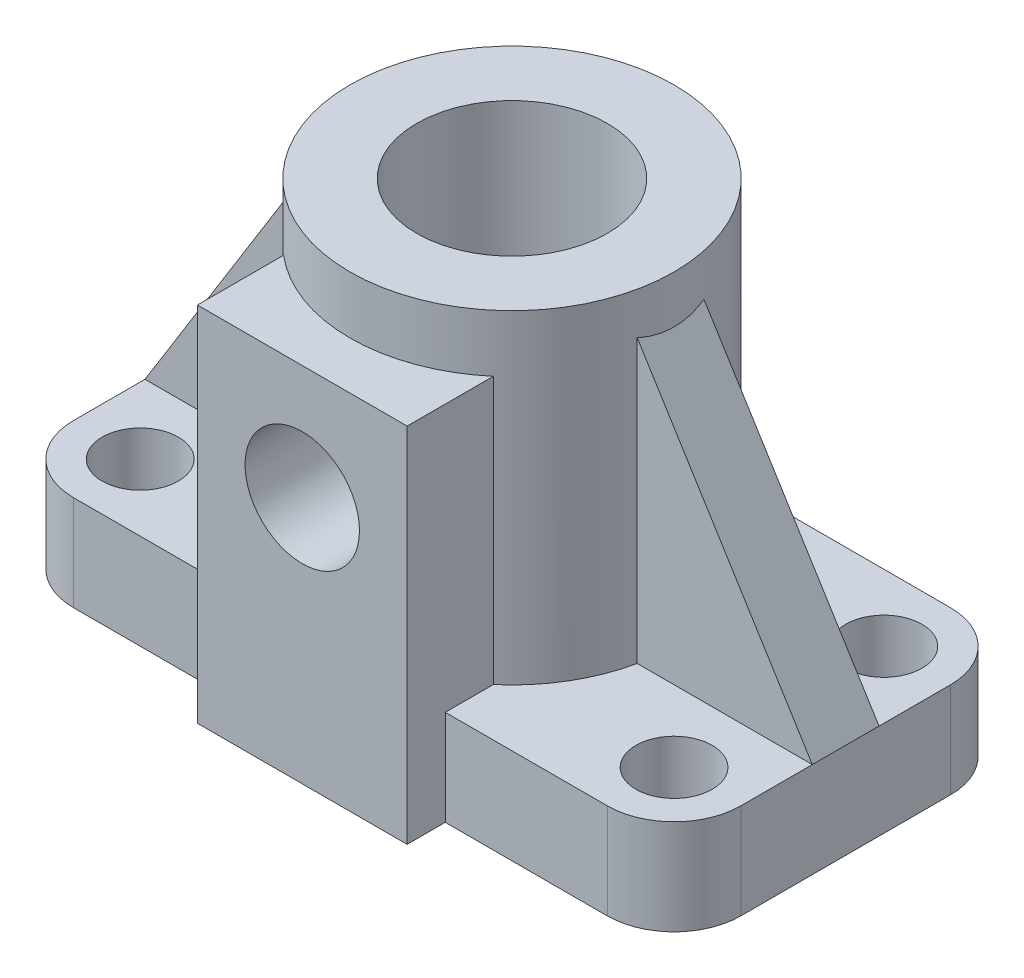
ISO-10303-21;
HEADER;
FILE_DESCRIPTION(('STEP AP214'),'2;1');
FILE_NAME('part.step','',(''),(''),'','','');
FILE_SCHEMA(('AUTOMOTIVE_DESIGN { 1 0 10303 214 1 1 1 1 }'));
ENDSEC;
DATA;
#1=APPLICATION_CONTEXT('core data for automotive mechanical design processes');
#2=APPLICATION_PROTOCOL_DEFINITION('international standard','automotive_design',2000,#1);
#3=PRODUCT_CONTEXT('',#1,'mechanical');
#4=PRODUCT('Part','Part','',(#3));
#5=PRODUCT_RELATED_PRODUCT_CATEGORY('part','',(#4));
#6=PRODUCT_DEFINITION_FORMATION('','',#4);
#7=PRODUCT_DEFINITION_CONTEXT('part definition',#1,'design');
#8=PRODUCT_DEFINITION('design','',#6,#7);
#9=PRODUCT_DEFINITION_SHAPE('','',#8);
#10=(LENGTH_UNIT() NAMED_UNIT(*) SI_UNIT(.MILLI.,.METRE.));
#11=(NAMED_UNIT(*) PLANE_ANGLE_UNIT() SI_UNIT($,.RADIAN.));
#12=(NAMED_UNIT(*) SI_UNIT($,.STERADIAN.) SOLID_ANGLE_UNIT());
#13=UNCERTAINTY_MEASURE_WITH_UNIT(LENGTH_MEASURE(1.E-05),#10,'distance_accuracy_value','');
#14=(GEOMETRIC_REPRESENTATION_CONTEXT(3) GLOBAL_UNCERTAINTY_ASSIGNED_CONTEXT((#13)) GLOBAL_UNIT_ASSIGNED_CONTEXT((#10,
#11,#12)) REPRESENTATION_CONTEXT('',''));
#15=CARTESIAN_POINT('',(0.,0.,0.));
#16=DIRECTION('',(0.,0.,1.));
#17=DIRECTION('',(1.,0.,0.));
#18=AXIS2_PLACEMENT_3D('',#15,#16,#17);
#19=CARTESIAN_POINT('',(-28.,10.,11.));
#20=DIRECTION('',(0.,-1.,0.));
#21=DIRECTION('',(0.,0.,-1.));
#22=AXIS2_PLACEMENT_3D('',#19,#20,#21);
#23=PLANE('',#22);
#24=CARTESIAN_POINT('',(28.,10.,-11.));
#25=DIRECTION('',(0.,1.,0.));
#26=DIRECTION('',(0.,0.,1.));
#27=AXIS2_PLACEMENT_3D('',#24,#25,#26);
#28=CIRCLE('',#27,4.);
#29=CARTESIAN_POINT('',(28.,10.,-7.));
#30=VERTEX_POINT('',#29);
#31=EDGE_CURVE('E248',#30,#30,#28,.T.);
#32=ORIENTED_EDGE('',*,*,#31,.F.);
#33=EDGE_LOOP('',(#32));
#34=FACE_BOUND('',#33,.T.);
#35=CARTESIAN_POINT('',(-28.,10.,-11.));
#36=DIRECTION('',(0.,1.,0.));
#37=DIRECTION('',(0.,0.,1.));
#38=AXIS2_PLACEMENT_3D('',#35,#36,#37);
#39=CIRCLE('',#38,4.);
#40=CARTESIAN_POINT('',(-28.,10.,-7.));
#41=VERTEX_POINT('',#40);
#42=EDGE_CURVE('E265',#41,#41,#39,.T.);
#43=ORIENTED_EDGE('',*,*,#42,.F.);
#44=EDGE_LOOP('',(#43));
#45=FACE_BOUND('',#44,.T.);
#46=DIRECTION('',(-1.,0.,0.));
#47=VECTOR('',#46,1.);
#48=CARTESIAN_POINT('',(-28.,10.,-3.5));
#49=LINE('',#48,#47);
#50=CARTESIAN_POINT('',(35.,10.,-3.5));
#51=VERTEX_POINT('',#50);
#52=CARTESIAN_POINT('',(16.6358047596141,10.,-3.5));
#53=VERTEX_POINT('',#52);
#54=EDGE_CURVE('E69',#51,#53,#49,.T.);
#55=ORIENTED_EDGE('',*,*,#54,.F.);
#56=DIRECTION('',(0.,0.,-1.));
#57=VECTOR('',#56,1.);
#58=CARTESIAN_POINT('',(35.,10.,10.9999999999999));
#59=LINE('',#58,#57);
#60=CARTESIAN_POINT('',(35.,10.,-10.9999999999999));
#61=VERTEX_POINT('',#60);
#62=EDGE_CURVE('E212',#51,#61,#59,.T.);
#63=ORIENTED_EDGE('',*,*,#62,.T.);
#64=CARTESIAN_POINT('',(28.,10.,-11.));
#65=DIRECTION('',(0.,1.,0.));
#66=DIRECTION('',(0.,0.,-1.));
#67=AXIS2_PLACEMENT_3D('',#64,#65,#66);
#68=CIRCLE('',#67,7.);
#69=CARTESIAN_POINT('',(28.,10.,-18.));
#70=VERTEX_POINT('',#69);
#71=EDGE_CURVE('E225',#61,#70,#68,.T.);
#72=ORIENTED_EDGE('',*,*,#71,.T.);
#73=DIRECTION('',(-1.,0.,0.));
#74=VECTOR('',#73,1.);
#75=CARTESIAN_POINT('',(-28.,10.,-18.));
#76=LINE('',#75,#74);
#77=CARTESIAN_POINT('',(-28.,10.,-18.));
#78=VERTEX_POINT('',#77);
#79=EDGE_CURVE('E230',#70,#78,#76,.T.);
#80=ORIENTED_EDGE('',*,*,#79,.T.);
#81=CARTESIAN_POINT('',(-28.,10.,-11.));
#82=DIRECTION('',(0.,1.,0.));
#83=DIRECTION('',(0.,0.,-1.));
#84=AXIS2_PLACEMENT_3D('',#81,#82,#83);
#85=CIRCLE('',#84,7.);
#86=CARTESIAN_POINT('',(-35.,10.,-10.9999999999999));
#87=VERTEX_POINT('',#86);
#88=EDGE_CURVE('E397',#78,#87,#85,.T.);
#89=ORIENTED_EDGE('',*,*,#88,.T.);
#90=DIRECTION('',(0.,0.,1.));
#91=VECTOR('',#90,1.);
#92=CARTESIAN_POINT('',(-35.,10.,10.9999999999999));
#93=LINE('',#92,#91);
#94=CARTESIAN_POINT('',(-35.,10.,-3.5));
#95=VERTEX_POINT('',#94);
#96=EDGE_CURVE('E393',#87,#95,#93,.T.);
#97=ORIENTED_EDGE('',*,*,#96,.T.);
#98=DIRECTION('',(-1.,0.,0.));
#99=VECTOR('',#98,1.);
#100=CARTESIAN_POINT('',(-28.,10.,-3.5));
#101=LINE('',#100,#99);
#102=CARTESIAN_POINT('',(-16.6358047596141,10.,-3.5));
#103=VERTEX_POINT('',#102);
#104=EDGE_CURVE('E430',#103,#95,#101,.T.);
#105=ORIENTED_EDGE('',*,*,#104,.F.);
#106=CARTESIAN_POINT('',(0.,10.,0.));
#107=DIRECTION('',(0.,-1.,0.));
#108=DIRECTION('',(0.,0.,-1.));
#109=AXIS2_PLACEMENT_3D('',#106,#107,#108);
#110=CIRCLE('',#109,17.);
#111=EDGE_CURVE('E216',#103,#53,#110,.T.);
#112=ORIENTED_EDGE('',*,*,#111,.T.);
#113=EDGE_LOOP('',(#55,#63,#72,#80,#89,#97,#105,#112));
#114=FACE_BOUND('',#113,.T.);
#115=ADVANCED_FACE('F51',(#34,#45,#114),#23,.F.);
#116=CARTESIAN_POINT('',(28.,10.,11.));
#117=DIRECTION('',(0.,1.,0.));
#118=DIRECTION('',(0.,0.,1.));
#119=AXIS2_PLACEMENT_3D('',#116,#117,#118);
#120=CIRCLE('',#119,4.);
#121=CARTESIAN_POINT('',(28.,10.,15.));
#122=VERTEX_POINT('',#121);
#123=EDGE_CURVE('E247',#122,#122,#120,.T.);
#124=ORIENTED_EDGE('',*,*,#123,.F.);
#125=EDGE_LOOP('',(#124));
#126=FACE_BOUND('',#125,.T.);
#127=CARTESIAN_POINT('',(35.,10.,11.));
#128=VERTEX_POINT('',#127);
#129=CARTESIAN_POINT('',(35.,10.,3.5));
#130=VERTEX_POINT('',#129);
#131=EDGE_CURVE('E224',#128,#130,#59,.T.);
#132=ORIENTED_EDGE('',*,*,#131,.T.);
#133=DIRECTION('',(-1.,0.,0.));
#134=VECTOR('',#133,1.);
#135=CARTESIAN_POINT('',(-28.,10.,3.5));
#136=LINE('',#135,#134);
#137=CARTESIAN_POINT('',(16.6358047596141,10.,3.5));
#138=VERTEX_POINT('',#137);
#139=EDGE_CURVE('E765',#130,#138,#136,.T.);
#140=ORIENTED_EDGE('',*,*,#139,.T.);
#141=CARTESIAN_POINT('',(11.,10.,12.9614813968157));
#142=VERTEX_POINT('',#141);
#143=EDGE_CURVE('E360',#138,#142,#110,.T.);
#144=ORIENTED_EDGE('',*,*,#143,.T.);
#145=DIRECTION('',(0.,0.,-1.));
#146=VECTOR('',#145,1.);
#147=CARTESIAN_POINT('',(11.,10.,11.));
#148=LINE('',#147,#146);
#149=CARTESIAN_POINT('',(11.,10.,18.));
#150=VERTEX_POINT('',#149);
#151=EDGE_CURVE('E321',#150,#142,#148,.T.);
#152=ORIENTED_EDGE('',*,*,#151,.F.);
#153=DIRECTION('',(1.,0.,0.));
#154=VECTOR('',#153,1.);
#155=CARTESIAN_POINT('',(-28.,10.,18.));
#156=LINE('',#155,#154);
#157=CARTESIAN_POINT('',(28.,10.,18.));
#158=VERTEX_POINT('',#157);
#159=EDGE_CURVE('E242',#150,#158,#156,.T.);
#160=ORIENTED_EDGE('',*,*,#159,.T.);
#161=CARTESIAN_POINT('',(28.,10.,11.));
#162=DIRECTION('',(0.,1.,0.));
#163=DIRECTION('',(0.,0.,1.));
#164=AXIS2_PLACEMENT_3D('',#161,#162,#163);
#165=CIRCLE('',#164,7.);
#166=EDGE_CURVE('E229',#158,#128,#165,.T.);
#167=ORIENTED_EDGE('',*,*,#166,.T.);
#168=EDGE_LOOP('',(#132,#140,#144,#152,#160,#167));
#169=FACE_BOUND('',#168,.T.);
#170=ADVANCED_FACE('F357',(#126,#169),#23,.F.);
#171=CARTESIAN_POINT('',(-28.,0.,11.));
#172=DIRECTION('',(0.,-1.,0.));
#173=DIRECTION('',(0.,0.,-1.));
#174=AXIS2_PLACEMENT_3D('',#171,#172,#173);
#175=PLANE('',#174);
#176=CARTESIAN_POINT('',(0.,0.,0.));
#177=DIRECTION('',(0.,-1.,0.));
#178=DIRECTION('',(0.,0.,-1.));
#179=AXIS2_PLACEMENT_3D('',#176,#177,#178);
#180=CIRCLE('',#179,10.);
#181=CARTESIAN_POINT('',(0.,0.,-10.));
#182=VERTEX_POINT('',#181);
#183=EDGE_CURVE('E748',#182,#182,#180,.T.);
#184=ORIENTED_EDGE('',*,*,#183,.F.);
#185=EDGE_LOOP('',(#184));
#186=FACE_BOUND('',#185,.T.);
#187=CARTESIAN_POINT('',(28.,0.,-11.));
#188=DIRECTION('',(0.,1.,0.));
#189=DIRECTION('',(0.,0.,-1.));
#190=AXIS2_PLACEMENT_3D('',#187,#188,#189);
#191=CIRCLE('',#190,7.);
#192=CARTESIAN_POINT('',(35.,0.,-10.9999999999999));
#193=VERTEX_POINT('',#192);
#194=CARTESIAN_POINT('',(28.,0.,-18.));
#195=VERTEX_POINT('',#194);
#196=EDGE_CURVE('E376',#193,#195,#191,.T.);
#197=ORIENTED_EDGE('',*,*,#196,.F.);
#198=DIRECTION('',(0.,0.,-1.));
#199=VECTOR('',#198,1.);
#200=CARTESIAN_POINT('',(35.,0.,10.9999999999999));
#201=LINE('',#200,#199);
#202=CARTESIAN_POINT('',(35.,0.,11.));
#203=VERTEX_POINT('',#202);
#204=EDGE_CURVE('E379',#203,#193,#201,.T.);
#205=ORIENTED_EDGE('',*,*,#204,.F.);
#206=CARTESIAN_POINT('',(28.,0.,11.));
#207=DIRECTION('',(0.,1.,0.));
#208=DIRECTION('',(0.,0.,1.));
#209=AXIS2_PLACEMENT_3D('',#206,#207,#208);
#210=CIRCLE('',#209,7.);
#211=CARTESIAN_POINT('',(28.,0.,18.));
#212=VERTEX_POINT('',#211);
#213=EDGE_CURVE('E281',#212,#203,#210,.T.);
#214=ORIENTED_EDGE('',*,*,#213,.F.);
#215=DIRECTION('',(1.,0.,0.));
#216=VECTOR('',#215,1.);
#217=CARTESIAN_POINT('',(-28.,0.,18.));
#218=LINE('',#217,#216);
#219=CARTESIAN_POINT('',(11.,0.,18.));
#220=VERTEX_POINT('',#219);
#221=EDGE_CURVE('E280',#220,#212,#218,.T.);
#222=ORIENTED_EDGE('',*,*,#221,.F.);
#223=DIRECTION('',(0.,0.,-1.));
#224=VECTOR('',#223,1.);
#225=CARTESIAN_POINT('',(11.,0.,11.));
#226=LINE('',#225,#224);
#227=CARTESIAN_POINT('',(11.,0.,22.));
#228=VERTEX_POINT('',#227);
#229=EDGE_CURVE('E61',#228,#220,#226,.T.);
#230=ORIENTED_EDGE('',*,*,#229,.F.);
#231=DIRECTION('',(-1.,0.,0.));
#232=VECTOR('',#231,1.);
#233=CARTESIAN_POINT('',(-28.,0.,22.));
#234=LINE('',#233,#232);
#235=CARTESIAN_POINT('',(-11.,0.,22.));
#236=VERTEX_POINT('',#235);
#237=EDGE_CURVE('E303',#228,#236,#234,.T.);
#238=ORIENTED_EDGE('',*,*,#237,.T.);
#239=DIRECTION('',(0.,0.,-1.));
#240=VECTOR('',#239,1.);
#241=CARTESIAN_POINT('',(-11.,0.,11.));
#242=LINE('',#241,#240);
#243=CARTESIAN_POINT('',(-11.,0.,18.));
#244=VERTEX_POINT('',#243);
#245=EDGE_CURVE('E12',#236,#244,#242,.T.);
#246=ORIENTED_EDGE('',*,*,#245,.T.);
#247=CARTESIAN_POINT('',(-28.,0.,18.));
#248=VERTEX_POINT('',#247);
#249=EDGE_CURVE('E276',#248,#244,#218,.T.);
#250=ORIENTED_EDGE('',*,*,#249,.F.);
#251=CARTESIAN_POINT('',(-28.,0.,11.));
#252=DIRECTION('',(0.,1.,0.));
#253=DIRECTION('',(0.,0.,-1.));
#254=AXIS2_PLACEMENT_3D('',#251,#252,#253);
#255=CIRCLE('',#254,7.);
#256=CARTESIAN_POINT('',(-35.,0.,10.9999999999999));
#257=VERTEX_POINT('',#256);
#258=EDGE_CURVE('E252',#257,#248,#255,.T.);
#259=ORIENTED_EDGE('',*,*,#258,.F.);
#260=DIRECTION('',(0.,0.,1.));
#261=VECTOR('',#260,1.);
#262=CARTESIAN_POINT('',(-35.,0.,10.9999999999999));
#263=LINE('',#262,#261);
#264=CARTESIAN_POINT('',(-35.,0.,-10.9999999999999));
#265=VERTEX_POINT('',#264);
#266=EDGE_CURVE('E241',#265,#257,#263,.T.);
#267=ORIENTED_EDGE('',*,*,#266,.F.);
#268=CARTESIAN_POINT('',(-28.,0.,-11.));
#269=DIRECTION('',(0.,1.,0.));
#270=DIRECTION('',(0.,0.,-1.));
#271=AXIS2_PLACEMENT_3D('',#268,#269,#270);
#272=CIRCLE('',#271,7.);
#273=CARTESIAN_POINT('',(-28.,0.,-18.));
#274=VERTEX_POINT('',#273);
#275=EDGE_CURVE('E370',#274,#265,#272,.T.);
#276=ORIENTED_EDGE('',*,*,#275,.F.);
#277=DIRECTION('',(-1.,0.,0.));
#278=VECTOR('',#277,1.);
#279=CARTESIAN_POINT('',(-28.,0.,-18.));
#280=LINE('',#279,#278);
#281=EDGE_CURVE('E373',#195,#274,#280,.T.);
#282=ORIENTED_EDGE('',*,*,#281,.F.);
#283=EDGE_LOOP('',(#197,#205,#214,#222,#230,#238,#246,#250,#259,#267,#276,#282));
#284=FACE_BOUND('',#283,.T.);
#285=CARTESIAN_POINT('',(-28.,0.,11.));
#286=DIRECTION('',(0.,1.,0.));
#287=DIRECTION('',(0.,0.,1.));
#288=AXIS2_PLACEMENT_3D('',#285,#286,#287);
#289=CIRCLE('',#288,4.);
#290=CARTESIAN_POINT('',(-28.,0.,15.));
#291=VERTEX_POINT('',#290);
#292=EDGE_CURVE('E261',#291,#291,#289,.T.);
#293=ORIENTED_EDGE('',*,*,#292,.T.);
#294=EDGE_LOOP('',(#293));
#295=FACE_BOUND('',#294,.T.);
#296=CARTESIAN_POINT('',(28.,0.,11.));
#297=DIRECTION('',(0.,1.,0.));
#298=DIRECTION('',(0.,0.,1.));
#299=AXIS2_PLACEMENT_3D('',#296,#297,#298);
#300=CIRCLE('',#299,4.);
#301=CARTESIAN_POINT('',(28.,0.,15.));
#302=VERTEX_POINT('',#301);
#303=EDGE_CURVE('E253',#302,#302,#300,.T.);
#304=ORIENTED_EDGE('',*,*,#303,.T.);
#305=EDGE_LOOP('',(#304));
#306=FACE_BOUND('',#305,.T.);
#307=CARTESIAN_POINT('',(28.,0.,-11.));
#308=DIRECTION('',(0.,1.,0.));
#309=DIRECTION('',(0.,0.,1.));
#310=AXIS2_PLACEMENT_3D('',#307,#308,#309);
#311=CIRCLE('',#310,4.);
#312=CARTESIAN_POINT('',(28.,0.,-7.));
#313=VERTEX_POINT('',#312);
#314=EDGE_CURVE('E243',#313,#313,#311,.T.);
#315=ORIENTED_EDGE('',*,*,#314,.T.);
#316=EDGE_LOOP('',(#315));
#317=FACE_BOUND('',#316,.T.);
#318=CARTESIAN_POINT('',(-28.,0.,-11.));
#319=DIRECTION('',(0.,1.,0.));
#320=DIRECTION('',(0.,0.,1.));
#321=AXIS2_PLACEMENT_3D('',#318,#319,#320);
#322=CIRCLE('',#321,4.);
#323=CARTESIAN_POINT('',(-28.,0.,-7.));
#324=VERTEX_POINT('',#323);
#325=EDGE_CURVE('E269',#324,#324,#322,.T.);
#326=ORIENTED_EDGE('',*,*,#325,.T.);
#327=EDGE_LOOP('',(#326));
#328=FACE_BOUND('',#327,.T.);
#329=ADVANCED_FACE('F53',(#186,#284,#295,#306,#317,#328),#175,.T.);
#330=CARTESIAN_POINT('',(0.,38.,0.));
#331=DIRECTION('',(0.,-1.,0.));
#332=DIRECTION('',(0.,0.,-1.));
#333=AXIS2_PLACEMENT_3D('',#330,#331,#332);
#334=PLANE('',#333);
#335=DIRECTION('',(0.,0.,-1.));
#336=VECTOR('',#335,1.);
#337=CARTESIAN_POINT('',(-11.,38.,11.));
#338=LINE('',#337,#336);
#339=CARTESIAN_POINT('',(-11.,38.,22.));
#340=VERTEX_POINT('',#339);
#341=CARTESIAN_POINT('',(-11.,38.,12.9614813968157));
#342=VERTEX_POINT('',#341);
#343=EDGE_CURVE('E307',#340,#342,#338,.T.);
#344=ORIENTED_EDGE('',*,*,#343,.F.);
#345=DIRECTION('',(-1.,0.,0.));
#346=VECTOR('',#345,1.);
#347=CARTESIAN_POINT('',(-28.,38.,22.));
#348=LINE('',#347,#346);
#349=CARTESIAN_POINT('',(11.,38.,22.));
#350=VERTEX_POINT('',#349);
#351=EDGE_CURVE('E298',#350,#340,#348,.T.);
#352=ORIENTED_EDGE('',*,*,#351,.F.);
#353=DIRECTION('',(0.,0.,-1.));
#354=VECTOR('',#353,1.);
#355=CARTESIAN_POINT('',(11.,38.,11.));
#356=LINE('',#355,#354);
#357=CARTESIAN_POINT('',(11.,38.,12.9614813968157));
#358=VERTEX_POINT('',#357);
#359=EDGE_CURVE('E311',#350,#358,#356,.T.);
#360=ORIENTED_EDGE('',*,*,#359,.T.);
#361=CARTESIAN_POINT('',(0.,38.,0.));
#362=DIRECTION('',(0.,-1.,0.));
#363=DIRECTION('',(0.,0.,-1.));
#364=AXIS2_PLACEMENT_3D('',#361,#362,#363);
#365=CIRCLE('',#364,17.);
#366=EDGE_CURVE('E55',#342,#358,#365,.F.);
#367=ORIENTED_EDGE('',*,*,#366,.F.);
#368=EDGE_LOOP('',(#344,#352,#360,#367));
#369=FACE_BOUND('',#368,.T.);
#370=ADVANCED_FACE('F341',(#369),#334,.F.);
#371=CARTESIAN_POINT('',(-28.,38.,22.));
#372=DIRECTION('',(0.,0.,1.));
#373=DIRECTION('',(1.,0.,0.));
#374=AXIS2_PLACEMENT_3D('',#371,#372,#373);
#375=PLANE('',#374);
#376=CARTESIAN_POINT('',(0.,26.,22.));
#377=DIRECTION('',(0.,0.,1.));
#378=DIRECTION('',(1.,0.,0.));
#379=AXIS2_PLACEMENT_3D('',#376,#377,#378);
#380=CIRCLE('',#379,6.);
#381=CARTESIAN_POINT('',(6.,26.,22.));
#382=VERTEX_POINT('',#381);
#383=EDGE_CURVE('E494',#382,#382,#380,.T.);
#384=ORIENTED_EDGE('',*,*,#383,.F.);
#385=EDGE_LOOP('',(#384));
#386=FACE_BOUND('',#385,.T.);
#387=ORIENTED_EDGE('',*,*,#237,.F.);
#388=DIRECTION('',(0.,-1.,0.));
#389=VECTOR('',#388,1.);
#390=CARTESIAN_POINT('',(11.,38.,22.));
#391=LINE('',#390,#389);
#392=EDGE_CURVE('E295',#350,#228,#391,.T.);
#393=ORIENTED_EDGE('',*,*,#392,.F.);
#394=ORIENTED_EDGE('',*,*,#351,.T.);
#395=DIRECTION('',(0.,-1.,0.));
#396=VECTOR('',#395,1.);
#397=CARTESIAN_POINT('',(-11.,38.,22.));
#398=LINE('',#397,#396);
#399=EDGE_CURVE('E299',#340,#236,#398,.T.);
#400=ORIENTED_EDGE('',*,*,#399,.T.);
#401=EDGE_LOOP('',(#387,#393,#394,#400));
#402=FACE_BOUND('',#401,.T.);
#403=ADVANCED_FACE('F349',(#386,#402),#375,.T.);
#404=CARTESIAN_POINT('',(-11.,38.,11.));
#405=DIRECTION('',(-1.,0.,0.));
#406=DIRECTION('',(0.,0.,1.));
#407=AXIS2_PLACEMENT_3D('',#404,#405,#406);
#408=PLANE('',#407);
#409=DIRECTION('',(0.,0.,-1.));
#410=VECTOR('',#409,1.);
#411=CARTESIAN_POINT('',(-11.,10.,11.));
#412=LINE('',#411,#410);
#413=CARTESIAN_POINT('',(-11.,10.,18.));
#414=VERTEX_POINT('',#413);
#415=CARTESIAN_POINT('',(-11.,10.,12.9614813968157));
#416=VERTEX_POINT('',#415);
#417=EDGE_CURVE('E282',#414,#416,#412,.T.);
#418=ORIENTED_EDGE('',*,*,#417,.F.);
#419=DIRECTION('',(0.,1.,0.));
#420=VECTOR('',#419,1.);
#421=CARTESIAN_POINT('',(-11.,10.,18.));
#422=LINE('',#421,#420);
#423=EDGE_CURVE('E286',#244,#414,#422,.T.);
#424=ORIENTED_EDGE('',*,*,#423,.F.);
#425=ORIENTED_EDGE('',*,*,#245,.F.);
#426=ORIENTED_EDGE('',*,*,#399,.F.);
#427=ORIENTED_EDGE('',*,*,#343,.T.);
#428=DIRECTION('',(0.,-1.,0.));
#429=VECTOR('',#428,1.);
#430=CARTESIAN_POINT('',(-11.,44.,12.9614813968157));
#431=LINE('',#430,#429);
#432=EDGE_CURVE('E302',#342,#416,#431,.T.);
#433=ORIENTED_EDGE('',*,*,#432,.T.);
#434=EDGE_LOOP('',(#418,#424,#425,#426,#427,#433));
#435=FACE_BOUND('',#434,.T.);
#436=ADVANCED_FACE('F345',(#435),#408,.T.);
#437=CARTESIAN_POINT('',(11.,38.,11.));
#438=DIRECTION('',(-1.,0.,0.));
#439=DIRECTION('',(0.,0.,1.));
#440=AXIS2_PLACEMENT_3D('',#437,#438,#439);
#441=PLANE('',#440);
#442=DIRECTION('',(0.,1.,0.));
#443=VECTOR('',#442,1.);
#444=CARTESIAN_POINT('',(11.,10.,18.));
#445=LINE('',#444,#443);
#446=EDGE_CURVE('E318',#220,#150,#445,.T.);
#447=ORIENTED_EDGE('',*,*,#446,.T.);
#448=ORIENTED_EDGE('',*,*,#151,.T.);
#449=DIRECTION('',(0.,-1.,0.));
#450=VECTOR('',#449,1.);
#451=CARTESIAN_POINT('',(11.,44.,12.9614813968157));
#452=LINE('',#451,#450);
#453=EDGE_CURVE('E326',#358,#142,#452,.T.);
#454=ORIENTED_EDGE('',*,*,#453,.F.);
#455=ORIENTED_EDGE('',*,*,#359,.F.);
#456=ORIENTED_EDGE('',*,*,#392,.T.);
#457=ORIENTED_EDGE('',*,*,#229,.T.);
#458=EDGE_LOOP('',(#447,#448,#454,#455,#456,#457));
#459=FACE_BOUND('',#458,.T.);
#460=ADVANCED_FACE('F352',(#459),#441,.F.);
#461=CARTESIAN_POINT('',(-28.,10.,-11.));
#462=DIRECTION('',(0.,-1.,0.));
#463=DIRECTION('',(0.,0.,-1.));
#464=AXIS2_PLACEMENT_3D('',#461,#462,#463);
#465=CYLINDRICAL_SURFACE('',#464,4.);
#466=ORIENTED_EDGE('',*,*,#42,.T.);
#467=EDGE_LOOP('',(#466));
#468=FACE_BOUND('',#467,.T.);
#469=ORIENTED_EDGE('',*,*,#325,.F.);
#470=EDGE_LOOP('',(#469));
#471=FACE_BOUND('',#470,.T.);
#472=ADVANCED_FACE('F559',(#468,#471),#465,.F.);
#473=CARTESIAN_POINT('',(28.,10.,11.));
#474=DIRECTION('',(0.,-1.,0.));
#475=DIRECTION('',(0.,0.,-1.));
#476=AXIS2_PLACEMENT_3D('',#473,#474,#475);
#477=CYLINDRICAL_SURFACE('',#476,4.);
#478=ORIENTED_EDGE('',*,*,#123,.T.);
#479=EDGE_LOOP('',(#478));
#480=FACE_BOUND('',#479,.T.);
#481=ORIENTED_EDGE('',*,*,#303,.F.);
#482=EDGE_LOOP('',(#481));
#483=FACE_BOUND('',#482,.T.);
#484=ADVANCED_FACE('F561',(#480,#483),#477,.F.);
#485=CARTESIAN_POINT('',(28.,10.,-11.));
#486=DIRECTION('',(0.,-1.,0.));
#487=DIRECTION('',(0.,0.,-1.));
#488=AXIS2_PLACEMENT_3D('',#485,#486,#487);
#489=CYLINDRICAL_SURFACE('',#488,4.);
#490=ORIENTED_EDGE('',*,*,#31,.T.);
#491=EDGE_LOOP('',(#490));
#492=FACE_BOUND('',#491,.T.);
#493=ORIENTED_EDGE('',*,*,#314,.F.);
#494=EDGE_LOOP('',(#493));
#495=FACE_BOUND('',#494,.T.);
#496=ADVANCED_FACE('F546',(#492,#495),#489,.F.);
#497=CARTESIAN_POINT('',(-28.,10.,11.));
#498=DIRECTION('',(0.,-1.,0.));
#499=DIRECTION('',(0.,0.,-1.));
#500=AXIS2_PLACEMENT_3D('',#497,#498,#499);
#501=CYLINDRICAL_SURFACE('',#500,4.);
#502=CARTESIAN_POINT('',(-28.,10.,11.));
#503=DIRECTION('',(0.,1.,0.));
#504=DIRECTION('',(0.,0.,1.));
#505=AXIS2_PLACEMENT_3D('',#502,#503,#504);
#506=CIRCLE('',#505,4.);
#507=CARTESIAN_POINT('',(-28.,10.,15.));
#508=VERTEX_POINT('',#507);
#509=EDGE_CURVE('E257',#508,#508,#506,.T.);
#510=ORIENTED_EDGE('',*,*,#509,.T.);
#511=EDGE_LOOP('',(#510));
#512=FACE_BOUND('',#511,.T.);
#513=ORIENTED_EDGE('',*,*,#292,.F.);
#514=EDGE_LOOP('',(#513));
#515=FACE_BOUND('',#514,.T.);
#516=ADVANCED_FACE('F543',(#512,#515),#501,.F.);
#517=CARTESIAN_POINT('',(35.,10.,10.9999999999999));
#518=DIRECTION('',(-1.,0.,0.));
#519=DIRECTION('',(0.,0.,1.));
#520=AXIS2_PLACEMENT_3D('',#517,#518,#519);
#521=PLANE('',#520);
#522=ORIENTED_EDGE('',*,*,#204,.T.);
#523=DIRECTION('',(0.,-1.,0.));
#524=VECTOR('',#523,1.);
#525=CARTESIAN_POINT('',(35.,10.,-10.9999999999999));
#526=LINE('',#525,#524);
#527=EDGE_CURVE('E221',#61,#193,#526,.T.);
#528=ORIENTED_EDGE('',*,*,#527,.F.);
#529=ORIENTED_EDGE('',*,*,#62,.F.);
#530=DIRECTION('',(0.,0.,-1.));
#531=VECTOR('',#530,1.);
#532=CARTESIAN_POINT('',(35.,10.,10.9999999999999));
#533=LINE('',#532,#531);
#534=EDGE_CURVE('E193',#130,#51,#533,.T.);
#535=ORIENTED_EDGE('',*,*,#534,.F.);
#536=ORIENTED_EDGE('',*,*,#131,.F.);
#537=DIRECTION('',(0.,-1.,0.));
#538=VECTOR('',#537,1.);
#539=CARTESIAN_POINT('',(35.,10.,11.));
#540=LINE('',#539,#538);
#541=EDGE_CURVE('E450',#128,#203,#540,.T.);
#542=ORIENTED_EDGE('',*,*,#541,.T.);
#543=EDGE_LOOP('',(#522,#528,#529,#535,#536,#542));
#544=FACE_BOUND('',#543,.T.);
#545=ADVANCED_FACE('F219',(#544),#521,.F.);
#546=CARTESIAN_POINT('',(28.,10.,-11.));
#547=DIRECTION('',(0.,-1.,0.));
#548=DIRECTION('',(0.,0.,-1.));
#549=AXIS2_PLACEMENT_3D('',#546,#547,#548);
#550=CYLINDRICAL_SURFACE('',#549,7.);
#551=ORIENTED_EDGE('',*,*,#196,.T.);
#552=DIRECTION('',(0.,-1.,0.));
#553=VECTOR('',#552,1.);
#554=CARTESIAN_POINT('',(28.,10.,-18.));
#555=LINE('',#554,#553);
#556=EDGE_CURVE('E416',#70,#195,#555,.T.);
#557=ORIENTED_EDGE('',*,*,#556,.F.);
#558=ORIENTED_EDGE('',*,*,#71,.F.);
#559=ORIENTED_EDGE('',*,*,#527,.T.);
#560=EDGE_LOOP('',(#551,#557,#558,#559));
#561=FACE_BOUND('',#560,.T.);
#562=ADVANCED_FACE('F589',(#561),#550,.T.);
#563=CARTESIAN_POINT('',(-28.,10.,-18.));
#564=DIRECTION('',(0.,0.,1.));
#565=DIRECTION('',(1.,0.,0.));
#566=AXIS2_PLACEMENT_3D('',#563,#564,#565);
#567=PLANE('',#566);
#568=ORIENTED_EDGE('',*,*,#281,.T.);
#569=DIRECTION('',(0.,-1.,0.));
#570=VECTOR('',#569,1.);
#571=CARTESIAN_POINT('',(-28.,10.,-18.));
#572=LINE('',#571,#570);
#573=EDGE_CURVE('E409',#78,#274,#572,.T.);
#574=ORIENTED_EDGE('',*,*,#573,.F.);
#575=ORIENTED_EDGE('',*,*,#79,.F.);
#576=ORIENTED_EDGE('',*,*,#556,.T.);
#577=EDGE_LOOP('',(#568,#574,#575,#576));
#578=FACE_BOUND('',#577,.T.);
#579=ADVANCED_FACE('F410',(#578),#567,.F.);
#580=CARTESIAN_POINT('',(-28.,10.,-11.));
#581=DIRECTION('',(0.,-1.,0.));
#582=DIRECTION('',(0.,0.,-1.));
#583=AXIS2_PLACEMENT_3D('',#580,#581,#582);
#584=CYLINDRICAL_SURFACE('',#583,7.);
#585=ORIENTED_EDGE('',*,*,#275,.T.);
#586=DIRECTION('',(0.,-1.,0.));
#587=VECTOR('',#586,1.);
#588=CARTESIAN_POINT('',(-35.,10.,-10.9999999999999));
#589=LINE('',#588,#587);
#590=EDGE_CURVE('E415',#87,#265,#589,.T.);
#591=ORIENTED_EDGE('',*,*,#590,.F.);
#592=ORIENTED_EDGE('',*,*,#88,.F.);
#593=ORIENTED_EDGE('',*,*,#573,.T.);
#594=EDGE_LOOP('',(#585,#591,#592,#593));
#595=FACE_BOUND('',#594,.T.);
#596=ADVANCED_FACE('F418',(#595),#584,.T.);
#597=CARTESIAN_POINT('',(-35.,10.,10.9999999999999));
#598=DIRECTION('',(1.,0.,0.));
#599=DIRECTION('',(0.,0.,-1.));
#600=AXIS2_PLACEMENT_3D('',#597,#598,#599);
#601=PLANE('',#600);
#602=CARTESIAN_POINT('',(-35.,10.,3.5));
#603=VERTEX_POINT('',#602);
#604=CARTESIAN_POINT('',(-35.,10.,10.9999999999999));
#605=VERTEX_POINT('',#604);
#606=EDGE_CURVE('E398',#603,#605,#93,.T.);
#607=ORIENTED_EDGE('',*,*,#606,.F.);
#608=DIRECTION('',(0.,0.,1.));
#609=VECTOR('',#608,1.);
#610=CARTESIAN_POINT('',(-35.,10.,11.));
#611=LINE('',#610,#609);
#612=EDGE_CURVE('E429',#603,#95,#611,.F.);
#613=ORIENTED_EDGE('',*,*,#612,.T.);
#614=ORIENTED_EDGE('',*,*,#96,.F.);
#615=ORIENTED_EDGE('',*,*,#590,.T.);
#616=ORIENTED_EDGE('',*,*,#266,.T.);
#617=DIRECTION('',(0.,-1.,0.));
#618=VECTOR('',#617,1.);
#619=CARTESIAN_POINT('',(-35.,10.,10.9999999999999));
#620=LINE('',#619,#618);
#621=EDGE_CURVE('E424',#605,#257,#620,.T.);
#622=ORIENTED_EDGE('',*,*,#621,.F.);
#623=EDGE_LOOP('',(#607,#613,#614,#615,#616,#622));
#624=FACE_BOUND('',#623,.T.);
#625=ADVANCED_FACE('F428',(#624),#601,.F.);
#626=CARTESIAN_POINT('',(28.,10.,11.));
#627=DIRECTION('',(0.,-1.,0.));
#628=DIRECTION('',(0.,0.,-1.));
#629=AXIS2_PLACEMENT_3D('',#626,#627,#628);
#630=CYLINDRICAL_SURFACE('',#629,7.);
#631=ORIENTED_EDGE('',*,*,#213,.T.);
#632=ORIENTED_EDGE('',*,*,#541,.F.);
#633=ORIENTED_EDGE('',*,*,#166,.F.);
#634=DIRECTION('',(0.,-1.,0.));
#635=VECTOR('',#634,1.);
#636=CARTESIAN_POINT('',(28.,10.,18.));
#637=LINE('',#636,#635);
#638=EDGE_CURVE('E365',#158,#212,#637,.T.);
#639=ORIENTED_EDGE('',*,*,#638,.T.);
#640=EDGE_LOOP('',(#631,#632,#633,#639));
#641=FACE_BOUND('',#640,.T.);
#642=ADVANCED_FACE('F539',(#641),#630,.T.);
#643=CARTESIAN_POINT('',(-28.,10.,11.));
#644=DIRECTION('',(0.,-1.,0.));
#645=DIRECTION('',(0.,0.,-1.));
#646=AXIS2_PLACEMENT_3D('',#643,#644,#645);
#647=CYLINDRICAL_SURFACE('',#646,7.);
#648=ORIENTED_EDGE('',*,*,#258,.T.);
#649=DIRECTION('',(0.,-1.,0.));
#650=VECTOR('',#649,1.);
#651=CARTESIAN_POINT('',(-28.,10.,18.));
#652=LINE('',#651,#650);
#653=CARTESIAN_POINT('',(-28.,10.,18.));
#654=VERTEX_POINT('',#653);
#655=EDGE_CURVE('E291',#654,#248,#652,.T.);
#656=ORIENTED_EDGE('',*,*,#655,.F.);
#657=CARTESIAN_POINT('',(-28.,10.,11.));
#658=DIRECTION('',(0.,1.,0.));
#659=DIRECTION('',(0.,0.,-1.));
#660=AXIS2_PLACEMENT_3D('',#657,#658,#659);
#661=CIRCLE('',#660,7.);
#662=EDGE_CURVE('E237',#605,#654,#661,.T.);
#663=ORIENTED_EDGE('',*,*,#662,.F.);
#664=ORIENTED_EDGE('',*,*,#621,.T.);
#665=EDGE_LOOP('',(#648,#656,#663,#664));
#666=FACE_BOUND('',#665,.T.);
#667=ADVANCED_FACE('F466',(#666),#647,.T.);
#668=ORIENTED_EDGE('',*,*,#509,.F.);
#669=EDGE_LOOP('',(#668));
#670=FACE_BOUND('',#669,.T.);
#671=CARTESIAN_POINT('',(-16.6358047596141,10.,3.5));
#672=VERTEX_POINT('',#671);
#673=EDGE_CURVE('E287',#416,#672,#110,.T.);
#674=ORIENTED_EDGE('',*,*,#673,.T.);
#675=DIRECTION('',(-1.,0.,0.));
#676=VECTOR('',#675,1.);
#677=CARTESIAN_POINT('',(-28.,10.,3.5));
#678=LINE('',#677,#676);
#679=EDGE_CURVE('E465',#672,#603,#678,.T.);
#680=ORIENTED_EDGE('',*,*,#679,.T.);
#681=ORIENTED_EDGE('',*,*,#606,.T.);
#682=ORIENTED_EDGE('',*,*,#662,.T.);
#683=EDGE_CURVE('E236',#654,#414,#156,.T.);
#684=ORIENTED_EDGE('',*,*,#683,.T.);
#685=ORIENTED_EDGE('',*,*,#417,.T.);
#686=EDGE_LOOP('',(#674,#680,#681,#682,#684,#685));
#687=FACE_BOUND('',#686,.T.);
#688=ADVANCED_FACE('F464',(#670,#687),#23,.F.);
#689=CARTESIAN_POINT('',(-28.,10.,18.));
#690=DIRECTION('',(0.,0.,-1.));
#691=DIRECTION('',(-1.,0.,0.));
#692=AXIS2_PLACEMENT_3D('',#689,#690,#691);
#693=PLANE('',#692);
#694=ORIENTED_EDGE('',*,*,#249,.T.);
#695=ORIENTED_EDGE('',*,*,#423,.T.);
#696=ORIENTED_EDGE('',*,*,#683,.F.);
#697=ORIENTED_EDGE('',*,*,#655,.T.);
#698=EDGE_LOOP('',(#694,#695,#696,#697));
#699=FACE_BOUND('',#698,.T.);
#700=ADVANCED_FACE('F468',(#699),#693,.F.);
#701=ORIENTED_EDGE('',*,*,#446,.F.);
#702=ORIENTED_EDGE('',*,*,#221,.T.);
#703=ORIENTED_EDGE('',*,*,#638,.F.);
#704=ORIENTED_EDGE('',*,*,#159,.F.);
#705=EDGE_LOOP('',(#701,#702,#703,#704));
#706=FACE_BOUND('',#705,.T.);
#707=ADVANCED_FACE('F362',(#706),#693,.F.);
#708=CARTESIAN_POINT('',(0.,44.,0.));
#709=DIRECTION('',(0.,-1.,0.));
#710=DIRECTION('',(0.,0.,-1.));
#711=AXIS2_PLACEMENT_3D('',#708,#709,#710);
#712=CYLINDRICAL_SURFACE('',#711,17.);
#713=CARTESIAN_POINT('',(0.,44.,0.));
#714=DIRECTION('',(0.,-1.,0.));
#715=DIRECTION('',(0.,0.,-1.));
#716=AXIS2_PLACEMENT_3D('',#713,#714,#715);
#717=CIRCLE('',#716,17.);
#718=CARTESIAN_POINT('',(0.,44.,-17.));
#719=VERTEX_POINT('',#718);
#720=EDGE_CURVE('E746',#719,#719,#717,.T.);
#721=ORIENTED_EDGE('',*,*,#720,.T.);
#722=EDGE_LOOP('',(#721));
#723=FACE_BOUND('',#722,.T.);
#724=CARTESIAN_POINT('',(0.,66.3888888888889,0.));
#725=DIRECTION('',(0.849640166198119,-0.527362861778143,0.));
#726=DIRECTION('',(-0.527362861778143,-0.849640166198119,0.));
#727=AXIS2_PLACEMENT_3D('',#724,#725,#726);
#728=ELLIPSE('',#727,32.2358687577658,17.);
#729=CARTESIAN_POINT('',(-16.6358047596141,39.5867589983995,3.5));
#730=VERTEX_POINT('',#729);
#731=CARTESIAN_POINT('',(-16.6358047596141,39.5867589983995,-3.5));
#732=VERTEX_POINT('',#731);
#733=EDGE_CURVE('E471',#730,#732,#728,.T.);
#734=ORIENTED_EDGE('',*,*,#733,.F.);
#735=DIRECTION('',(0.,-1.,0.));
#736=VECTOR('',#735,1.);
#737=CARTESIAN_POINT('',(-16.6358047596141,44.,3.5));
#738=LINE('',#737,#736);
#739=EDGE_CURVE('E470',#672,#730,#738,.F.);
#740=ORIENTED_EDGE('',*,*,#739,.F.);
#741=ORIENTED_EDGE('',*,*,#673,.F.);
#742=ORIENTED_EDGE('',*,*,#432,.F.);
#743=ORIENTED_EDGE('',*,*,#366,.T.);
#744=ORIENTED_EDGE('',*,*,#453,.T.);
#745=ORIENTED_EDGE('',*,*,#143,.F.);
#746=DIRECTION('',(0.,-1.,0.));
#747=VECTOR('',#746,1.);
#748=CARTESIAN_POINT('',(16.6358047596141,44.,3.5));
#749=LINE('',#748,#747);
#750=CARTESIAN_POINT('',(16.6358047596141,39.5867589983995,3.5));
#751=VERTEX_POINT('',#750);
#752=EDGE_CURVE('E767',#751,#138,#749,.T.);
#753=ORIENTED_EDGE('',*,*,#752,.F.);
#754=CARTESIAN_POINT('',(0.,66.3888888888889,0.));
#755=DIRECTION('',(0.849640166198119,0.527362861778143,0.));
#756=DIRECTION('',(0.527362861778143,-0.849640166198119,0.));
#757=AXIS2_PLACEMENT_3D('',#754,#755,#756);
#758=ELLIPSE('',#757,32.2358687577658,17.);
#759=CARTESIAN_POINT('',(16.6358047596141,39.5867589983995,-3.5));
#760=VERTEX_POINT('',#759);
#761=EDGE_CURVE('E204',#760,#751,#758,.F.);
#762=ORIENTED_EDGE('',*,*,#761,.F.);
#763=DIRECTION('',(0.,-1.,0.));
#764=VECTOR('',#763,1.);
#765=CARTESIAN_POINT('',(16.6358047596141,44.,-3.5));
#766=LINE('',#765,#764);
#767=EDGE_CURVE('E207',#760,#53,#766,.T.);
#768=ORIENTED_EDGE('',*,*,#767,.T.);
#769=ORIENTED_EDGE('',*,*,#111,.F.);
#770=DIRECTION('',(0.,-1.,0.));
#771=VECTOR('',#770,1.);
#772=CARTESIAN_POINT('',(-16.6358047596141,44.,-3.5));
#773=LINE('',#772,#771);
#774=EDGE_CURVE('E432',#103,#732,#773,.F.);
#775=ORIENTED_EDGE('',*,*,#774,.T.);
#776=EDGE_LOOP('',(#734,#740,#741,#742,#743,#744,#745,#753,#762,#768,#769,#775));
#777=FACE_BOUND('',#776,.T.);
#778=ADVANCED_FACE('F337',(#723,#777),#712,.T.);
#779=CARTESIAN_POINT('',(0.,44.,0.));
#780=DIRECTION('',(0.,-1.,0.));
#781=DIRECTION('',(0.,0.,-1.));
#782=AXIS2_PLACEMENT_3D('',#779,#780,#781);
#783=CYLINDRICAL_SURFACE('',#782,10.);
#784=CARTESIAN_POINT('',(0.,44.,0.));
#785=DIRECTION('',(0.,-1.,0.));
#786=DIRECTION('',(0.,0.,-1.));
#787=AXIS2_PLACEMENT_3D('',#784,#785,#786);
#788=CIRCLE('',#787,10.);
#789=CARTESIAN_POINT('',(0.,44.,-10.));
#790=VERTEX_POINT('',#789);
#791=EDGE_CURVE('E441',#790,#790,#788,.T.);
#792=ORIENTED_EDGE('',*,*,#791,.F.);
#793=EDGE_LOOP('',(#792));
#794=FACE_BOUND('',#793,.T.);
#795=ORIENTED_EDGE('',*,*,#183,.T.);
#796=EDGE_LOOP('',(#795));
#797=FACE_BOUND('',#796,.T.);
#798=CARTESIAN_POINT('',(6.,26.,8.));
#799=CARTESIAN_POINT('',(6.00000088162881,25.8490456434254,7.99999864910224));
#800=CARTESIAN_POINT('',(5.99429471853482,25.6981016854433,8.00428833679091));
#801=CARTESIAN_POINT('',(5.97158029595807,25.397555936048,8.02124863219104));
#802=CARTESIAN_POINT('',(5.95457278892218,25.2479540559509,8.03391868193524));
#803=CARTESIAN_POINT('',(5.90953108490972,24.9512018982482,8.06710734950176));
#804=CARTESIAN_POINT('',(5.88148913384211,24.8040534206506,8.08763148624475));
#805=CARTESIAN_POINT('',(5.81481476566768,24.5133219087256,8.13569970975774));
#806=CARTESIAN_POINT('',(5.77617733255313,24.3697405983302,8.16324712098121));
#807=CARTESIAN_POINT('',(5.64577521853615,23.9478605518692,8.25448068613034));
#808=CARTESIAN_POINT('',(5.53912991890453,23.6759307968708,8.32706572533656));
#809=CARTESIAN_POINT('',(5.29011262993967,23.1542040224385,8.48743711552897));
#810=CARTESIAN_POINT('',(5.1477299838664,22.9044136349968,8.57522799841511));
#811=CARTESIAN_POINT('',(4.81082834240806,22.4001920891897,8.76915411563735));
#812=CARTESIAN_POINT('',(4.61206328098179,22.1489277555092,8.87621984994956));
#813=CARTESIAN_POINT('',(4.28586871155472,21.797987685222,9.03582231230531));
#814=CARTESIAN_POINT('',(4.17237380323689,21.6852642510026,9.08889374486005));
#815=CARTESIAN_POINT('',(3.93632146632464,21.4688858169748,9.19358587409139));
#816=CARTESIAN_POINT('',(3.81376237338527,21.365232490265,9.24520630192437));
#817=CARTESIAN_POINT('',(3.54628422867016,21.1568975546556,9.35129695987745));
#818=CARTESIAN_POINT('',(3.40038171956539,21.0533236050396,9.40546909597467));
#819=CARTESIAN_POINT('',(3.09877025729808,20.8590094895466,9.50910263041578));
#820=CARTESIAN_POINT('',(2.94306573077009,20.768263589711,9.55856613020448));
#821=CARTESIAN_POINT('',(2.62273316271579,20.600561371684,9.65137615734108));
#822=CARTESIAN_POINT('',(2.45810899446899,20.5235991295821,9.69472531078955));
#823=CARTESIAN_POINT('',(2.12101861519267,20.384440252949,9.77400834963342));
#824=CARTESIAN_POINT('',(1.94855369844294,20.3222411919145,9.80994345348834));
#825=CARTESIAN_POINT('',(1.61397887310178,20.2187593496713,9.87021533870989));
#826=CARTESIAN_POINT('',(1.45245106417627,20.1760471039253,9.89533161968247));
#827=CARTESIAN_POINT('',(1.12541380029543,20.1041144696476,9.9378378885394));
#828=CARTESIAN_POINT('',(0.959904576767922,20.0748932989041,9.95522832436573));
#829=CARTESIAN_POINT('',(0.62649343424952,20.0304296823523,9.98175593635162));
#830=CARTESIAN_POINT('',(0.458593493576803,20.0151762914354,9.99089957459115));
#831=CARTESIAN_POINT('',(0.121864540254614,19.9988707438372,10.0006753626941));
#832=CARTESIAN_POINT('',(-0.0469643761207628,19.9978171422977,10.001308378531));
#833=CARTESIAN_POINT('',(-0.36294740404219,20.0091678657037,9.99450134908414));
#834=CARTESIAN_POINT('',(-0.510186129271386,20.0199149503719,9.988055423997));
#835=CARTESIAN_POINT('',(-0.803109015744183,20.0521658739156,9.96877939171652));
#836=CARTESIAN_POINT('',(-0.948792654511345,20.0736732186155,9.95594720380779));
#837=CARTESIAN_POINT('',(-1.237487698066,20.1271667170708,9.92419812325367));
#838=CARTESIAN_POINT('',(-1.38050002312209,20.1591491890412,9.90528336854382));
#839=CARTESIAN_POINT('',(-1.66304733568859,20.2332317837565,9.86178063907867));
#840=CARTESIAN_POINT('',(-1.80258095855973,20.2753358101838,9.83719047557732));
#841=CARTESIAN_POINT('',(-2.07805771309281,20.3694607985628,9.78271380551187));
#842=CARTESIAN_POINT('',(-2.213977685514,20.4215335296188,9.75279971061266));
#843=CARTESIAN_POINT('',(-2.48078460487242,20.5349522175053,9.68837327507413));
#844=CARTESIAN_POINT('',(-2.61166974042208,20.596301473334,9.65385929910513));
#845=CARTESIAN_POINT('',(-2.99582005885702,20.7934838317702,9.54441159722313));
#846=CARTESIAN_POINT('',(-3.24076653470714,20.9425159652093,9.46353385850713));
#847=CARTESIAN_POINT('',(-3.73233294691791,21.2913651286593,9.28151313170845));
#848=CARTESIAN_POINT('',(-3.97565808525398,21.4951219048796,9.1791034522392));
#849=CARTESIAN_POINT('',(-4.42687522495971,21.9376478552301,8.97020600808983));
#850=CARTESIAN_POINT('',(-4.63471843137172,22.1764644181152,8.86371287022898));
#851=CARTESIAN_POINT('',(-4.92797850102127,22.5727205951449,8.70226894648173));
#852=CARTESIAN_POINT('',(-5.02692901573438,22.7195283288438,8.64532309391492));
#853=CARTESIAN_POINT('',(-5.21202996714069,23.0223793946211,8.53500632501968));
#854=CARTESIAN_POINT('',(-5.29817829905958,23.1784242394655,8.48163599732456));
#855=CARTESIAN_POINT('',(-5.45672185252633,23.4987829977477,8.38051460035721));
#856=CARTESIAN_POINT('',(-5.52913768295357,23.6630840444061,8.33275515227876));
#857=CARTESIAN_POINT('',(-5.65946619795369,23.9992733676409,8.24479422007601));
#858=CARTESIAN_POINT('',(-5.71738457983655,24.1711586323816,8.20458976848892));
#859=CARTESIAN_POINT('',(-5.80533969433249,24.4778932747098,8.14249128928077));
#860=CARTESIAN_POINT('',(-5.83872912399161,24.6113710623681,8.11852850235761));
#861=CARTESIAN_POINT('',(-5.89638461996681,24.8812188353217,8.07675184174586));
#862=CARTESIAN_POINT('',(-5.92065270055165,25.0175881750399,8.05893661056294));
#863=CARTESIAN_POINT('',(-5.95972506119774,25.2922567264776,8.03008524390666));
#864=CARTESIAN_POINT('',(-5.97453842890673,25.4305539540774,8.01904259918271));
#865=CARTESIAN_POINT('',(-5.99451827965109,25.7082367175518,8.00411818497226));
#866=CARTESIAN_POINT('',(-5.99968455809828,25.8476222764441,8.00023656735144));
#867=CARTESIAN_POINT('',(-6.00028779640298,26.1266187221661,7.9997841667535));
#868=CARTESIAN_POINT('',(-5.99571136282797,26.2662296552011,8.00322344790999));
#869=CARTESIAN_POINT('',(-5.97687561218467,26.5444250961031,8.01729967500599));
#870=CARTESIAN_POINT('',(-5.96261624468159,26.6830095986202,8.02793665843563));
#871=CARTESIAN_POINT('',(-5.92461644085682,26.9582396449522,8.05602115916921));
#872=CARTESIAN_POINT('',(-5.90087143720405,27.0948842218242,8.0734719572314));
#873=CARTESIAN_POINT('',(-5.84422673057314,27.365333055754,8.11456896902298));
#874=CARTESIAN_POINT('',(-5.81132329025206,27.4991361292185,8.13821771175741));
#875=CARTESIAN_POINT('',(-5.6995591577321,27.8947012270525,8.21726148194673));
#876=CARTESIAN_POINT('',(-5.60755471788689,28.1512538881402,8.28082455624298));
#877=CARTESIAN_POINT('',(-5.39184793321014,28.6459475353118,8.42286190152657));
#878=CARTESIAN_POINT('',(-5.26813363152923,28.8840815320743,8.50134179431292));
#879=CARTESIAN_POINT('',(-4.96667794724345,29.3809727151561,8.68148215419451));
#880=CARTESIAN_POINT('',(-4.78321740719474,29.6357084330294,8.78477096130257));
#881=CARTESIAN_POINT('',(-4.48048054495124,29.9937195359984,8.94082079344033));
#882=CARTESIAN_POINT('',(-4.37488391749691,30.1091219100945,8.99306477859642));
#883=CARTESIAN_POINT('',(-4.15478036587187,30.3315431826378,9.09684476254055));
#884=CARTESIAN_POINT('',(-4.04027186784563,30.4385605935553,9.14838063437488));
#885=CARTESIAN_POINT('',(-3.78725916521218,30.6570525367295,9.25623949495887));
#886=CARTESIAN_POINT('',(-3.64757344821549,30.7672869117514,9.31230980002968));
#887=CARTESIAN_POINT('',(-3.35801798035468,30.9754893222743,9.4205941057635));
#888=CARTESIAN_POINT('',(-3.20815238798258,31.0734623206243,9.47280966312089));
#889=CARTESIAN_POINT('',(-2.89897367155154,31.256252646494,9.57195369339457));
#890=CARTESIAN_POINT('',(-2.73966268600566,31.3410729362886,9.61888335615541));
#891=CARTESIAN_POINT('',(-2.4125448812816,31.4965816617811,9.70609419072746));
#892=CARTESIAN_POINT('',(-2.24473922428781,31.567272024128,9.74637626882177));
#893=CARTESIAN_POINT('',(-1.91432616994729,31.6889418509117,9.81640309379021));
#894=CARTESIAN_POINT('',(-1.75222599070733,31.7409798077395,9.84670057004255));
#895=CARTESIAN_POINT('',(-1.42300707093317,31.8313101560026,9.89963820465492));
#896=CARTESIAN_POINT('',(-1.25588851732987,31.869603058745,9.92227864784978));
#897=CARTESIAN_POINT('',(-0.918243836101149,31.931801456657,9.95919887612942));
#898=CARTESIAN_POINT('',(-0.747721074946195,31.9557205024728,9.97348653527641));
#899=CARTESIAN_POINT('',(-0.4047517280391,31.9888098960502,9.99328101588267));
#900=CARTESIAN_POINT('',(-0.232305396027999,31.997982166446,9.99878898200748));
#901=CARTESIAN_POINT('',(0.0897214575485268,32.0011926694547,10.0007158823898));
#902=CARTESIAN_POINT('',(0.239280869884811,31.9970879970575,9.99825014101708));
#903=CARTESIAN_POINT('',(0.537418992701517,31.977749677153,9.9866626014441));
#904=CARTESIAN_POINT('',(0.6859977276892,31.962516308824,9.9775409702157));
#905=CARTESIAN_POINT('',(0.98106917410329,31.9211231987912,9.952860128368));
#906=CARTESIAN_POINT('',(1.12756198655361,31.894963988114,9.93730123061827));
#907=CARTESIAN_POINT('',(1.41746403997303,31.8320493795146,9.9001089462329));
#908=CARTESIAN_POINT('',(1.56087318838717,31.7952936640182,9.87847537754162));
#909=CARTESIAN_POINT('',(1.84140451131592,31.7122913284712,9.83001294823669));
#910=CARTESIAN_POINT('',(1.97859106269808,31.6662091862011,9.80327452445085));
#911=CARTESIAN_POINT('',(2.24839766655468,31.5646663940233,9.74493680815261));
#912=CARTESIAN_POINT('',(2.38101622374935,31.5092027076401,9.71333594213896));
#913=CARTESIAN_POINT('',(2.77099118695357,31.3294860441306,9.61215652370218));
#914=CARTESIAN_POINT('',(3.0206641926172,31.1918483176854,9.53616574328078));
#915=CARTESIAN_POINT('',(3.52109065838497,30.868291940321,9.36373418778332));
#916=CARTESIAN_POINT('',(3.76901891084856,30.6787539976608,9.26596893066758));
#917=CARTESIAN_POINT('',(4.23160593003125,30.2649589992621,9.06406113204371));
#918=CARTESIAN_POINT('',(4.44622730563912,30.0406634801235,8.95991160370153));
#919=CARTESIAN_POINT('',(4.75306699513206,29.6659057724075,8.79909217120191));
#920=CARTESIAN_POINT('',(4.85784420248668,29.5259090644312,8.74152637033407));
#921=CARTESIAN_POINT('',(5.05524371029082,29.2365378320188,8.62887051709429));
#922=CARTESIAN_POINT('',(5.14786302464979,29.0871610170107,8.57378107511544));
#923=CARTESIAN_POINT('',(5.32018482809803,28.7796928376403,8.46793169532304));
#924=CARTESIAN_POINT('',(5.39988894661096,28.621602575973,8.41717121173721));
#925=CARTESIAN_POINT('',(5.54554477107688,28.2974909141224,8.32192914439253));
#926=CARTESIAN_POINT('',(5.61150572034596,28.1314749375491,8.27744334698199));
#927=CARTESIAN_POINT('',(5.72385081019425,27.8067891175005,8.20010888837649));
#928=CARTESIAN_POINT('',(5.77142045549499,27.648689453262,8.16659343417489));
#929=CARTESIAN_POINT('',(5.85359345466856,27.3277264475687,8.10789739053264));
#930=CARTESIAN_POINT('',(5.88820525491189,27.1648662840819,8.08271137293097));
#931=CARTESIAN_POINT('',(5.94382312963065,26.8359096628891,8.04190038323599));
#932=CARTESIAN_POINT('',(5.96485065019987,26.6698187349462,8.02626034265943));
#933=CARTESIAN_POINT('',(5.99293771613585,26.3358140951684,8.00531155242235));
#934=CARTESIAN_POINT('',(5.99999901939882,26.1679006154094,8.00000150255065));
#935=CARTESIAN_POINT('',(6.,26.,8.));
#936=B_SPLINE_CURVE_WITH_KNOTS('',3,(#798,#799,#800,#801,#802,#803,#804,#805,#806,#807,#808,
#809,#810,#811,#812,#813,#814,#815,#816,#817,#818,#819,#820,#821,#822,#823,#824,#825,#826,#827,
#828,#829,#830,#831,#832,#833,#834,#835,#836,#837,#838,#839,#840,#841,#842,#843,#844,#845,#846,
#847,#848,#849,#850,#851,#852,#853,#854,#855,#856,#857,#858,#859,#860,#861,#862,#863,#864,#865,
#866,#867,#868,#869,#870,#871,#872,#873,#874,#875,#876,#877,#878,#879,#880,#881,#882,#883,#884,
#885,#886,#887,#888,#889,#890,#891,#892,#893,#894,#895,#896,#897,#898,#899,#900,#901,#902,#903,
#904,#905,#906,#907,#908,#909,#910,#911,#912,#913,#914,#915,#916,#917,#918,#919,#920,#921,#922,
#923,#924,#925,#926,#927,#928,#929,#930,#931,#932,#933,#934,#935),.UNSPECIFIED.,.T.,.F.,(4,2,2,
2,2,2,2,2,2,2,2,2,2,2,2,2,2,2,2,2,2,2,2,2,2,2,2,2,2,2,2,2,2,2,2,2,2,2,2,2,2,2,2,2,2,2,2,2,2,2,2,
2,2,2,2,2,2,2,2,2,2,2,2,2,2,2,2,2,4),(0.,0.452678131953081,0.905326127479809,1.35829277610849,
1.81147423500294,2.71030243772276,3.60939898666924,4.61842643340732,5.12364477538535,
5.62895611582986,6.18907007252824,6.7489328690842,7.30855446857232,7.86808402384475,
8.37422610792176,8.88033884221517,9.38605464793526,9.89171899563242,10.3345024918992,
10.777430346487,11.2202026880973,11.6631460729563,12.1084553973056,12.5539234605076,
13.4442631938077,14.4409496612456,15.4389959252679,15.9963343187221,16.5537642416308,
17.1103508709196,17.6667184242241,18.0852817260551,18.5037525421122,18.9218205257131,
19.3398973752831,19.7585493316179,20.1772034685705,20.5960594308093,21.0150865695569,
21.8512278120472,22.6876848036402,23.6749363767385,24.1693355999537,24.6638223341296,
25.2228243825863,25.7815994355499,26.3402484569055,26.8988212531045,27.4168373395204,
27.9348341540781,28.4523418690018,28.9697821075672,29.4181370808688,29.8664808069716,
30.3148027448461,30.7631381201982,31.2041651922951,31.6453352834275,32.5270550916606,
33.5044950178567,34.4830244255554,35.0347612934609,35.5866334204804,36.138435867192,
36.6898659785695,37.1945532695295,37.6989110127382,38.2024705458659,38.7059666930588),.UNSPECIFIED.);
#937=CARTESIAN_POINT('',(6.,26.,8.));
#938=VERTEX_POINT('',#937);
#939=EDGE_CURVE('E485',#938,#938,#936,.T.);
#940=ORIENTED_EDGE('',*,*,#939,.F.);
#941=EDGE_LOOP('',(#940));
#942=FACE_BOUND('',#941,.T.);
#943=ADVANCED_FACE('F571',(#794,#797,#942),#783,.F.);
#944=CARTESIAN_POINT('',(0.,44.,0.));
#945=DIRECTION('',(0.,-1.,0.));
#946=DIRECTION('',(0.,0.,-1.));
#947=AXIS2_PLACEMENT_3D('',#944,#945,#946);
#948=PLANE('',#947);
#949=ORIENTED_EDGE('',*,*,#791,.T.);
#950=EDGE_LOOP('',(#949));
#951=FACE_BOUND('',#950,.T.);
#952=ORIENTED_EDGE('',*,*,#720,.F.);
#953=EDGE_LOOP('',(#952));
#954=FACE_BOUND('',#953,.T.);
#955=ADVANCED_FACE('F578',(#951,#954),#948,.F.);
#956=CARTESIAN_POINT('',(0.,26.,-18.001));
#957=DIRECTION('',(0.,0.,1.));
#958=DIRECTION('',(1.,0.,0.));
#959=AXIS2_PLACEMENT_3D('',#956,#957,#958);
#960=CYLINDRICAL_SURFACE('',#959,6.);
#961=ORIENTED_EDGE('',*,*,#383,.T.);
#962=EDGE_LOOP('',(#961));
#963=FACE_BOUND('',#962,.T.);
#964=ORIENTED_EDGE('',*,*,#939,.T.);
#965=EDGE_LOOP('',(#964));
#966=FACE_BOUND('',#965,.T.);
#967=ADVANCED_FACE('F496',(#963,#966),#960,.F.);
#968=CARTESIAN_POINT('',(-35.,10.,0.));
#969=DIRECTION('',(0.849640166198119,-0.527362861778143,0.));
#970=DIRECTION('',(0.527362861778143,0.849640166198119,0.));
#971=AXIS2_PLACEMENT_3D('',#968,#969,#970);
#972=PLANE('',#971);
#973=ORIENTED_EDGE('',*,*,#612,.F.);
#974=DIRECTION('',(0.527362861778143,0.849640166198119,0.));
#975=VECTOR('',#974,1.);
#976=CARTESIAN_POINT('',(-35.,10.,3.5));
#977=LINE('',#976,#975);
#978=EDGE_CURVE('E433',#603,#730,#977,.T.);
#979=ORIENTED_EDGE('',*,*,#978,.T.);
#980=ORIENTED_EDGE('',*,*,#733,.T.);
#981=DIRECTION('',(0.527362861778143,0.849640166198119,0.));
#982=VECTOR('',#981,1.);
#983=CARTESIAN_POINT('',(-35.,10.,-3.5));
#984=LINE('',#983,#982);
#985=EDGE_CURVE('E77',#95,#732,#984,.T.);
#986=ORIENTED_EDGE('',*,*,#985,.F.);
#987=EDGE_LOOP('',(#973,#979,#980,#986));
#988=FACE_BOUND('',#987,.T.);
#989=ADVANCED_FACE('F501',(#988),#972,.F.);
#990=CARTESIAN_POINT('',(0.,22.,3.5));
#991=DIRECTION('',(0.,0.,1.));
#992=DIRECTION('',(1.,0.,0.));
#993=AXIS2_PLACEMENT_3D('',#990,#991,#992);
#994=PLANE('',#993);
#995=ORIENTED_EDGE('',*,*,#679,.F.);
#996=ORIENTED_EDGE('',*,*,#739,.T.);
#997=ORIENTED_EDGE('',*,*,#978,.F.);
#998=EDGE_LOOP('',(#995,#996,#997));
#999=FACE_BOUND('',#998,.T.);
#1000=ADVANCED_FACE('F504',(#999),#994,.T.);
#1001=CARTESIAN_POINT('',(0.,22.,-3.5));
#1002=DIRECTION('',(0.,0.,1.));
#1003=DIRECTION('',(1.,0.,0.));
#1004=AXIS2_PLACEMENT_3D('',#1001,#1002,#1003);
#1005=PLANE('',#1004);
#1006=ORIENTED_EDGE('',*,*,#774,.F.);
#1007=ORIENTED_EDGE('',*,*,#104,.T.);
#1008=ORIENTED_EDGE('',*,*,#985,.T.);
#1009=EDGE_LOOP('',(#1006,#1007,#1008));
#1010=FACE_BOUND('',#1009,.T.);
#1011=ADVANCED_FACE('F506',(#1010),#1005,.F.);
#1012=CARTESIAN_POINT('',(0.,22.,3.5));
#1013=DIRECTION('',(0.,0.,1.));
#1014=DIRECTION('',(1.,0.,0.));
#1015=AXIS2_PLACEMENT_3D('',#1012,#1013,#1014);
#1016=PLANE('',#1015);
#1017=DIRECTION('',(-0.527362861778143,0.849640166198119,0.));
#1018=VECTOR('',#1017,1.);
#1019=CARTESIAN_POINT('',(35.,10.,3.5));
#1020=LINE('',#1019,#1018);
#1021=EDGE_CURVE('E198',#130,#751,#1020,.T.);
#1022=ORIENTED_EDGE('',*,*,#1021,.T.);
#1023=ORIENTED_EDGE('',*,*,#752,.T.);
#1024=ORIENTED_EDGE('',*,*,#139,.F.);
#1025=EDGE_LOOP('',(#1022,#1023,#1024));
#1026=FACE_BOUND('',#1025,.T.);
#1027=ADVANCED_FACE('F509',(#1026),#1016,.T.);
#1028=CARTESIAN_POINT('',(0.,22.,-3.5));
#1029=DIRECTION('',(0.,0.,1.));
#1030=DIRECTION('',(1.,0.,0.));
#1031=AXIS2_PLACEMENT_3D('',#1028,#1029,#1030);
#1032=PLANE('',#1031);
#1033=ORIENTED_EDGE('',*,*,#767,.F.);
#1034=DIRECTION('',(-0.527362861778143,0.849640166198119,0.));
#1035=VECTOR('',#1034,1.);
#1036=CARTESIAN_POINT('',(35.,10.,-3.5));
#1037=LINE('',#1036,#1035);
#1038=EDGE_CURVE('E195',#51,#760,#1037,.T.);
#1039=ORIENTED_EDGE('',*,*,#1038,.F.);
#1040=ORIENTED_EDGE('',*,*,#54,.T.);
#1041=EDGE_LOOP('',(#1033,#1039,#1040));
#1042=FACE_BOUND('',#1041,.T.);
#1043=ADVANCED_FACE('F206',(#1042),#1032,.F.);
#1044=CARTESIAN_POINT('',(35.,10.,0.));
#1045=DIRECTION('',(0.849640166198119,0.527362861778143,0.));
#1046=DIRECTION('',(-0.527362861778143,0.849640166198119,0.));
#1047=AXIS2_PLACEMENT_3D('',#1044,#1045,#1046);
#1048=PLANE('',#1047);
#1049=ORIENTED_EDGE('',*,*,#1021,.F.);
#1050=ORIENTED_EDGE('',*,*,#534,.T.);
#1051=ORIENTED_EDGE('',*,*,#1038,.T.);
#1052=ORIENTED_EDGE('',*,*,#761,.T.);
#1053=EDGE_LOOP('',(#1049,#1050,#1051,#1052));
#1054=FACE_BOUND('',#1053,.T.);
#1055=ADVANCED_FACE('F194',(#1054),#1048,.T.);
#1056=CLOSED_SHELL('',(#115,#170,#329,#370,#403,#436,#460,#472,#484,#496,#516,#545,#562,#579,
#596,#625,#642,#667,#688,#700,#707,#778,#943,#955,#967,#989,#1000,#1011,#1027,#1043,#1055));
#1057=MANIFOLD_SOLID_BREP('B2',#1056);
#1058=ADVANCED_BREP_SHAPE_REPRESENTATION('',(#18,#1057),#14);
#1059=SHAPE_DEFINITION_REPRESENTATION(#9,#1058);
ENDSEC;
END-ISO-10303-21;
